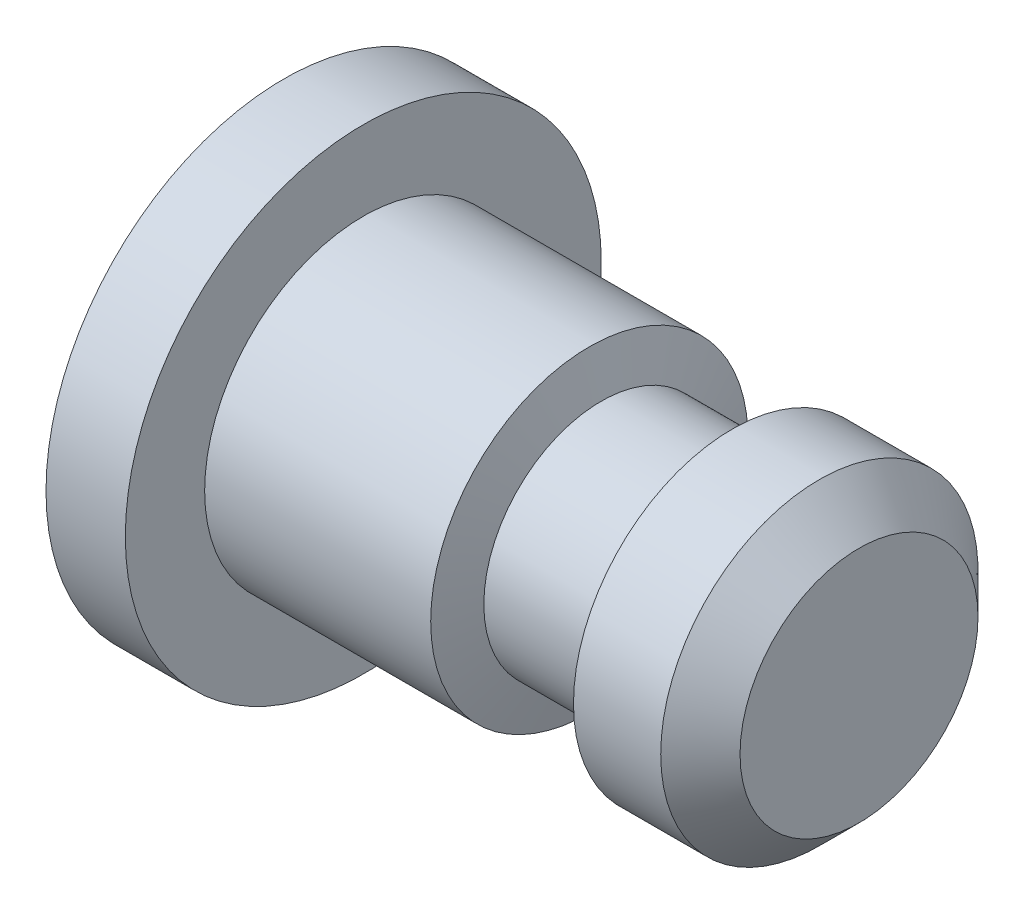
ISO-10303-21;
HEADER;
FILE_DESCRIPTION(('STEP AP214'),'2;1');
FILE_NAME('part.step','',(''),(''),'','','');
FILE_SCHEMA(('AUTOMOTIVE_DESIGN { 1 0 10303 214 1 1 1 1 }'));
ENDSEC;
DATA;
#1=APPLICATION_CONTEXT('core data for automotive mechanical design processes');
#2=APPLICATION_PROTOCOL_DEFINITION('international standard','automotive_design',2000,#1);
#3=PRODUCT_CONTEXT('',#1,'mechanical');
#4=PRODUCT('Part','Part','',(#3));
#5=PRODUCT_RELATED_PRODUCT_CATEGORY('part','',(#4));
#6=PRODUCT_DEFINITION_FORMATION('','',#4);
#7=PRODUCT_DEFINITION_CONTEXT('part definition',#1,'design');
#8=PRODUCT_DEFINITION('design','',#6,#7);
#9=PRODUCT_DEFINITION_SHAPE('','',#8);
#10=(LENGTH_UNIT() NAMED_UNIT(*) SI_UNIT(.MILLI.,.METRE.));
#11=(NAMED_UNIT(*) PLANE_ANGLE_UNIT() SI_UNIT($,.RADIAN.));
#12=(NAMED_UNIT(*) SI_UNIT($,.STERADIAN.) SOLID_ANGLE_UNIT());
#13=UNCERTAINTY_MEASURE_WITH_UNIT(LENGTH_MEASURE(1.E-05),#10,'distance_accuracy_value','');
#14=(GEOMETRIC_REPRESENTATION_CONTEXT(3) GLOBAL_UNCERTAINTY_ASSIGNED_CONTEXT((#13)) GLOBAL_UNIT_ASSIGNED_CONTEXT((#10,
#11,#12)) REPRESENTATION_CONTEXT('',''));
#15=CARTESIAN_POINT('',(0.,0.,0.));
#16=DIRECTION('',(0.,0.,1.));
#17=DIRECTION('',(1.,0.,0.));
#18=AXIS2_PLACEMENT_3D('',#15,#16,#17);
#19=CARTESIAN_POINT('',(0.,0.,0.));
#20=DIRECTION('',(-1.,0.,0.));
#21=DIRECTION('',(0.,0.,1.));
#22=AXIS2_PLACEMENT_3D('',#19,#20,#21);
#23=CYLINDRICAL_SURFACE('',#22,6.);
#24=CARTESIAN_POINT('',(0.,0.,0.));
#25=DIRECTION('',(-1.,0.,0.));
#26=DIRECTION('',(0.,0.,1.));
#27=AXIS2_PLACEMENT_3D('',#24,#25,#26);
#28=CIRCLE('',#27,6.);
#29=CARTESIAN_POINT('',(0.,0.,6.));
#30=VERTEX_POINT('',#29);
#31=EDGE_CURVE('E47',#30,#30,#28,.T.);
#32=ORIENTED_EDGE('',*,*,#31,.F.);
#33=EDGE_LOOP('',(#32));
#34=FACE_BOUND('',#33,.T.);
#35=CARTESIAN_POINT('',(2.,0.,0.));
#36=DIRECTION('',(-1.,0.,0.));
#37=DIRECTION('',(0.,0.,1.));
#38=AXIS2_PLACEMENT_3D('',#35,#36,#37);
#39=CIRCLE('',#38,6.);
#40=CARTESIAN_POINT('',(2.,0.,6.));
#41=VERTEX_POINT('',#40);
#42=EDGE_CURVE('E68',#41,#41,#39,.T.);
#43=ORIENTED_EDGE('',*,*,#42,.T.);
#44=EDGE_LOOP('',(#43));
#45=FACE_BOUND('',#44,.T.);
#46=ADVANCED_FACE('F35',(#34,#45),#23,.T.);
#47=CARTESIAN_POINT('',(0.,6.,0.));
#48=DIRECTION('',(1.,0.,0.));
#49=DIRECTION('',(0.,0.,-1.));
#50=AXIS2_PLACEMENT_3D('',#47,#48,#49);
#51=PLANE('',#50);
#52=ORIENTED_EDGE('',*,*,#31,.T.);
#53=EDGE_LOOP('',(#52));
#54=FACE_BOUND('',#53,.T.);
#55=ADVANCED_FACE('F110',(#54),#51,.F.);
#56=CARTESIAN_POINT('',(14.5,0.,0.));
#57=DIRECTION('',(-1.,0.,0.));
#58=DIRECTION('',(0.,0.,1.));
#59=AXIS2_PLACEMENT_3D('',#56,#57,#58);
#60=PLANE('',#59);
#61=CARTESIAN_POINT('',(14.5,0.,0.));
#62=DIRECTION('',(-1.,0.,0.));
#63=DIRECTION('',(0.,0.,1.));
#64=AXIS2_PLACEMENT_3D('',#61,#62,#63);
#65=CIRCLE('',#64,3.);
#66=CARTESIAN_POINT('',(14.5,0.,3.));
#67=VERTEX_POINT('',#66);
#68=EDGE_CURVE('E10',#67,#67,#65,.F.);
#69=ORIENTED_EDGE('',*,*,#68,.T.);
#70=EDGE_LOOP('',(#69));
#71=FACE_BOUND('',#70,.T.);
#72=ADVANCED_FACE('F105',(#71),#60,.F.);
#73=CARTESIAN_POINT('',(0.,0.,0.));
#74=DIRECTION('',(-1.,0.,0.));
#75=DIRECTION('',(0.,0.,1.));
#76=AXIS2_PLACEMENT_3D('',#73,#74,#75);
#77=CYLINDRICAL_SURFACE('',#76,4.);
#78=CARTESIAN_POINT('',(13.5,0.,0.));
#79=DIRECTION('',(-1.,0.,0.));
#80=DIRECTION('',(0.,0.,1.));
#81=AXIS2_PLACEMENT_3D('',#78,#79,#80);
#82=CIRCLE('',#81,4.);
#83=CARTESIAN_POINT('',(13.5,0.,4.));
#84=VERTEX_POINT('',#83);
#85=EDGE_CURVE('E43',#84,#84,#82,.T.);
#86=ORIENTED_EDGE('',*,*,#85,.T.);
#87=EDGE_LOOP('',(#86));
#88=FACE_BOUND('',#87,.T.);
#89=CARTESIAN_POINT('',(11.3,0.,0.));
#90=DIRECTION('',(-1.,0.,0.));
#91=DIRECTION('',(0.,0.,1.));
#92=AXIS2_PLACEMENT_3D('',#89,#90,#91);
#93=CIRCLE('',#92,4.);
#94=CARTESIAN_POINT('',(11.3,0.,4.));
#95=VERTEX_POINT('',#94);
#96=EDGE_CURVE('E51',#95,#95,#93,.T.);
#97=ORIENTED_EDGE('',*,*,#96,.F.);
#98=EDGE_LOOP('',(#97));
#99=FACE_BOUND('',#98,.T.);
#100=ADVANCED_FACE('F100',(#88,#99),#77,.T.);
#101=CARTESIAN_POINT('',(11.3,0.,0.));
#102=DIRECTION('',(1.,0.,0.));
#103=DIRECTION('',(0.,0.,-1.));
#104=AXIS2_PLACEMENT_3D('',#101,#102,#103);
#105=CONICAL_SURFACE('',#104,4.,1.28979337938662);
#106=CARTESIAN_POINT('',(11.,0.,0.));
#107=DIRECTION('',(-1.,0.,0.));
#108=DIRECTION('',(0.,0.,1.));
#109=AXIS2_PLACEMENT_3D('',#106,#107,#108);
#110=CIRCLE('',#109,2.96064488069385);
#111=CARTESIAN_POINT('',(11.,0.,2.96064488069385));
#112=VERTEX_POINT('',#111);
#113=EDGE_CURVE('E56',#112,#112,#110,.T.);
#114=ORIENTED_EDGE('',*,*,#113,.F.);
#115=EDGE_LOOP('',(#114));
#116=FACE_BOUND('',#115,.T.);
#117=ORIENTED_EDGE('',*,*,#96,.T.);
#118=EDGE_LOOP('',(#117));
#119=FACE_BOUND('',#118,.T.);
#120=ADVANCED_FACE('F94',(#116,#119),#105,.T.);
#121=CARTESIAN_POINT('',(0.,0.,0.));
#122=DIRECTION('',(-1.,0.,0.));
#123=DIRECTION('',(0.,0.,1.));
#124=AXIS2_PLACEMENT_3D('',#121,#122,#123);
#125=CYLINDRICAL_SURFACE('',#124,2.96064488069385);
#126=CARTESIAN_POINT('',(8.,0.,0.));
#127=DIRECTION('',(-1.,0.,0.));
#128=DIRECTION('',(0.,0.,1.));
#129=AXIS2_PLACEMENT_3D('',#126,#127,#128);
#130=CIRCLE('',#129,2.96064488069385);
#131=CARTESIAN_POINT('',(8.,0.,2.96064488069385));
#132=VERTEX_POINT('',#131);
#133=EDGE_CURVE('E59',#132,#132,#130,.T.);
#134=ORIENTED_EDGE('',*,*,#133,.F.);
#135=EDGE_LOOP('',(#134));
#136=FACE_BOUND('',#135,.T.);
#137=ORIENTED_EDGE('',*,*,#113,.T.);
#138=EDGE_LOOP('',(#137));
#139=FACE_BOUND('',#138,.T.);
#140=ADVANCED_FACE('F88',(#136,#139),#125,.T.);
#141=CARTESIAN_POINT('',(8.,0.,0.));
#142=DIRECTION('',(-1.,0.,0.));
#143=DIRECTION('',(0.,0.,1.));
#144=AXIS2_PLACEMENT_3D('',#141,#142,#143);
#145=CONICAL_SURFACE('',#144,2.96064488069385,1.28979337938662);
#146=CARTESIAN_POINT('',(7.7,0.,0.));
#147=DIRECTION('',(-1.,0.,0.));
#148=DIRECTION('',(0.,0.,1.));
#149=AXIS2_PLACEMENT_3D('',#146,#147,#148);
#150=CIRCLE('',#149,4.);
#151=CARTESIAN_POINT('',(7.7,0.,4.));
#152=VERTEX_POINT('',#151);
#153=EDGE_CURVE('E62',#152,#152,#150,.T.);
#154=ORIENTED_EDGE('',*,*,#153,.F.);
#155=EDGE_LOOP('',(#154));
#156=FACE_BOUND('',#155,.T.);
#157=ORIENTED_EDGE('',*,*,#133,.T.);
#158=EDGE_LOOP('',(#157));
#159=FACE_BOUND('',#158,.T.);
#160=ADVANCED_FACE('F82',(#156,#159),#145,.T.);
#161=CARTESIAN_POINT('',(0.,0.,0.));
#162=DIRECTION('',(-1.,0.,0.));
#163=DIRECTION('',(0.,0.,1.));
#164=AXIS2_PLACEMENT_3D('',#161,#162,#163);
#165=CYLINDRICAL_SURFACE('',#164,4.);
#166=CARTESIAN_POINT('',(2.,0.,0.));
#167=DIRECTION('',(-1.,0.,0.));
#168=DIRECTION('',(0.,0.,1.));
#169=AXIS2_PLACEMENT_3D('',#166,#167,#168);
#170=CIRCLE('',#169,4.);
#171=CARTESIAN_POINT('',(2.,0.,4.));
#172=VERTEX_POINT('',#171);
#173=EDGE_CURVE('E65',#172,#172,#170,.T.);
#174=ORIENTED_EDGE('',*,*,#173,.F.);
#175=EDGE_LOOP('',(#174));
#176=FACE_BOUND('',#175,.T.);
#177=ORIENTED_EDGE('',*,*,#153,.T.);
#178=EDGE_LOOP('',(#177));
#179=FACE_BOUND('',#178,.T.);
#180=ADVANCED_FACE('F76',(#176,#179),#165,.T.);
#181=CARTESIAN_POINT('',(2.,4.,0.));
#182=DIRECTION('',(-1.,0.,0.));
#183=DIRECTION('',(0.,0.,1.));
#184=AXIS2_PLACEMENT_3D('',#181,#182,#183);
#185=PLANE('',#184);
#186=ORIENTED_EDGE('',*,*,#42,.F.);
#187=EDGE_LOOP('',(#186));
#188=FACE_BOUND('',#187,.T.);
#189=ORIENTED_EDGE('',*,*,#173,.T.);
#190=EDGE_LOOP('',(#189));
#191=FACE_BOUND('',#190,.T.);
#192=ADVANCED_FACE('F73',(#188,#191),#185,.F.);
#193=CARTESIAN_POINT('',(13.5,0.,0.));
#194=DIRECTION('',(-1.,0.,0.));
#195=DIRECTION('',(0.,0.,1.));
#196=AXIS2_PLACEMENT_3D('',#193,#194,#195);
#197=CONICAL_SURFACE('',#196,4.,0.78539816339745);
#198=ORIENTED_EDGE('',*,*,#68,.F.);
#199=EDGE_LOOP('',(#198));
#200=FACE_BOUND('',#199,.T.);
#201=ORIENTED_EDGE('',*,*,#85,.F.);
#202=EDGE_LOOP('',(#201));
#203=FACE_BOUND('',#202,.T.);
#204=ADVANCED_FACE('F38',(#200,#203),#197,.T.);
#205=CLOSED_SHELL('',(#46,#55,#72,#100,#120,#140,#160,#180,#192,#204));
#206=MANIFOLD_SOLID_BREP('B2',#205);
#207=ADVANCED_BREP_SHAPE_REPRESENTATION('',(#18,#206),#14);
#208=SHAPE_DEFINITION_REPRESENTATION(#9,#207);
ENDSEC;
END-ISO-10303-21;
